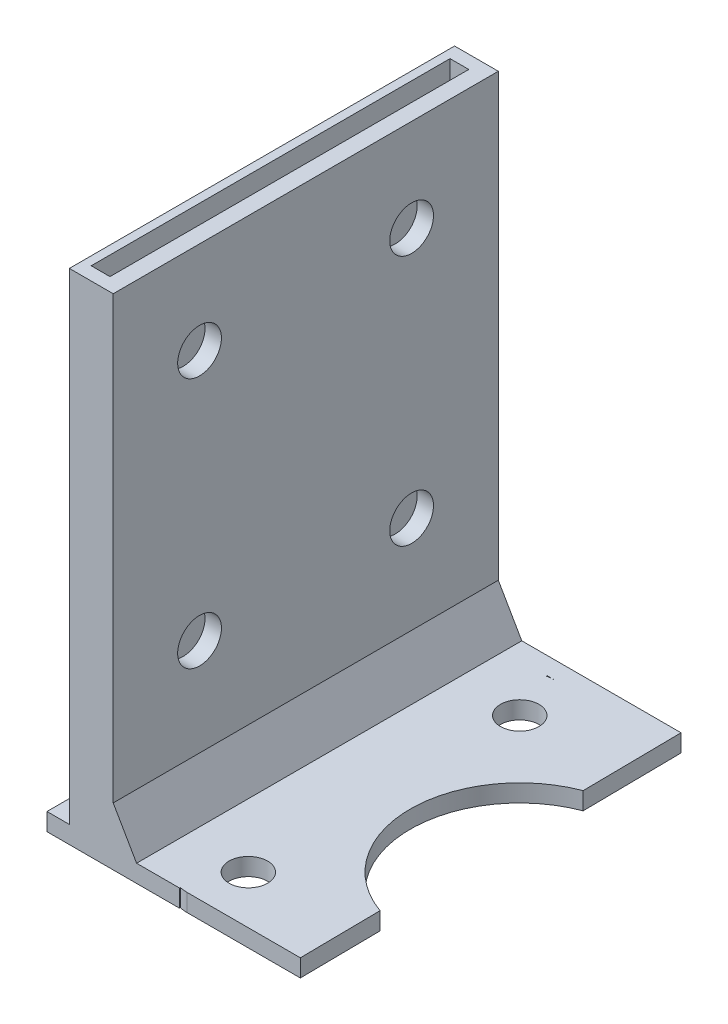
ISO-10303-21;
HEADER;
FILE_DESCRIPTION(('STEP AP214'),'2;1');
FILE_NAME('part.step','',(''),(''),'','','');
FILE_SCHEMA(('AUTOMOTIVE_DESIGN { 1 0 10303 214 1 1 1 1 }'));
ENDSEC;
DATA;
#1=APPLICATION_CONTEXT('core data for automotive mechanical design processes');
#2=APPLICATION_PROTOCOL_DEFINITION('international standard','automotive_design',2000,#1);
#3=PRODUCT_CONTEXT('',#1,'mechanical');
#4=PRODUCT('Part','Part','',(#3));
#5=PRODUCT_RELATED_PRODUCT_CATEGORY('part','',(#4));
#6=PRODUCT_DEFINITION_FORMATION('','',#4);
#7=PRODUCT_DEFINITION_CONTEXT('part definition',#1,'design');
#8=PRODUCT_DEFINITION('design','',#6,#7);
#9=PRODUCT_DEFINITION_SHAPE('','',#8);
#10=(LENGTH_UNIT() NAMED_UNIT(*) SI_UNIT(.MILLI.,.METRE.));
#11=(NAMED_UNIT(*) PLANE_ANGLE_UNIT() SI_UNIT($,.RADIAN.));
#12=(NAMED_UNIT(*) SI_UNIT($,.STERADIAN.) SOLID_ANGLE_UNIT());
#13=UNCERTAINTY_MEASURE_WITH_UNIT(LENGTH_MEASURE(1.E-05),#10,'distance_accuracy_value','');
#14=(GEOMETRIC_REPRESENTATION_CONTEXT(3) GLOBAL_UNCERTAINTY_ASSIGNED_CONTEXT((#13)) GLOBAL_UNIT_ASSIGNED_CONTEXT((#10,
#11,#12)) REPRESENTATION_CONTEXT('',''));
#15=CARTESIAN_POINT('',(0.,0.,0.));
#16=DIRECTION('',(0.,0.,1.));
#17=DIRECTION('',(1.,0.,0.));
#18=AXIS2_PLACEMENT_3D('',#15,#16,#17);
#19=CARTESIAN_POINT('',(3.,2.,0.));
#20=DIRECTION('',(0.,1.,0.));
#21=DIRECTION('',(0.,0.,1.));
#22=AXIS2_PLACEMENT_3D('',#19,#20,#21);
#23=PLANE('',#22);
#24=DIRECTION('',(0.,0.,-1.));
#25=VECTOR('',#24,1.);
#26=CARTESIAN_POINT('',(-22.7644014692472,2.,0.));
#27=LINE('',#26,#25);
#28=CARTESIAN_POINT('',(-22.7644014692472,2.,21.));
#29=VERTEX_POINT('',#28);
#30=CARTESIAN_POINT('',(-22.7644014692472,2.,-23.));
#31=VERTEX_POINT('',#30);
#32=EDGE_CURVE('E65',#29,#31,#27,.T.);
#33=ORIENTED_EDGE('',*,*,#32,.F.);
#34=DIRECTION('',(1.,0.,0.));
#35=VECTOR('',#34,1.);
#36=CARTESIAN_POINT('',(-23.,2.,21.));
#37=LINE('',#36,#35);
#38=CARTESIAN_POINT('',(-17.8654591215677,2.,21.));
#39=VERTEX_POINT('',#38);
#40=EDGE_CURVE('E321',#29,#39,#37,.T.);
#41=ORIENTED_EDGE('',*,*,#40,.T.);
#42=DIRECTION('',(0.,0.,-1.));
#43=VECTOR('',#42,1.);
#44=CARTESIAN_POINT('',(-17.8654591215677,2.,-21.));
#45=LINE('',#44,#43);
#46=CARTESIAN_POINT('',(-17.8654591215677,2.,20.9052503772351));
#47=VERTEX_POINT('',#46);
#48=EDGE_CURVE('E337',#39,#47,#45,.T.);
#49=ORIENTED_EDGE('',*,*,#48,.T.);
#50=CARTESIAN_POINT('',(-17.,2.,17.));
#51=DIRECTION('',(0.,1.,0.));
#52=DIRECTION('',(0.,0.,1.));
#53=AXIS2_PLACEMENT_3D('',#50,#51,#52);
#54=CIRCLE('',#53,4.);
#55=CARTESIAN_POINT('',(-17.,2.,21.));
#56=VERTEX_POINT('',#55);
#57=EDGE_CURVE('E334',#47,#56,#54,.T.);
#58=ORIENTED_EDGE('',*,*,#57,.T.);
#59=DIRECTION('',(1.,0.,0.));
#60=VECTOR('',#59,1.);
#61=CARTESIAN_POINT('',(-21.,2.,21.));
#62=LINE('',#61,#60);
#63=CARTESIAN_POINT('',(-4.0568713567306,2.,21.));
#64=VERTEX_POINT('',#63);
#65=EDGE_CURVE('E318',#56,#64,#62,.T.);
#66=ORIENTED_EDGE('',*,*,#65,.T.);
#67=DIRECTION('',(0.0117787362988032,0.,0.999930628279384));
#68=VECTOR('',#67,1.);
#69=CARTESIAN_POINT('',(-4.57517170926519,2.,-23.));
#70=LINE('',#69,#68);
#71=CARTESIAN_POINT('',(-4.16541339197231,2.,11.7855560443272));
#72=VERTEX_POINT('',#71);
#73=EDGE_CURVE('E271',#72,#64,#70,.T.);
#74=ORIENTED_EDGE('',*,*,#73,.F.);
#75=CARTESIAN_POINT('',(0.,2.,0.));
#76=DIRECTION('',(0.,1.,0.));
#77=DIRECTION('',(0.,0.,1.));
#78=AXIS2_PLACEMENT_3D('',#75,#76,#77);
#79=CIRCLE('',#78,12.5);
#80=CARTESIAN_POINT('',(-4.44187623782958,2.,-11.6841660159296));
#81=VERTEX_POINT('',#80);
#82=EDGE_CURVE('E302',#81,#72,#79,.T.);
#83=ORIENTED_EDGE('',*,*,#82,.F.);
#84=CARTESIAN_POINT('',(-4.57517170926519,2.,-23.));
#85=VERTEX_POINT('',#84);
#86=EDGE_CURVE('E272',#85,#81,#70,.T.);
#87=ORIENTED_EDGE('',*,*,#86,.F.);
#88=DIRECTION('',(1.,0.,0.));
#89=VECTOR('',#88,1.);
#90=CARTESIAN_POINT('',(-23.,2.,-23.));
#91=LINE('',#90,#89);
#92=EDGE_CURVE('E61',#31,#85,#91,.T.);
#93=ORIENTED_EDGE('',*,*,#92,.F.);
#94=EDGE_LOOP('',(#33,#41,#49,#58,#66,#74,#83,#87,#93));
#95=FACE_BOUND('',#94,.T.);
#96=CARTESIAN_POINT('',(-17.8654591215677,2.,-20.9052503772351));
#97=VERTEX_POINT('',#96);
#98=CARTESIAN_POINT('',(-17.8654591215677,2.,-21.));
#99=VERTEX_POINT('',#98);
#100=EDGE_CURVE('E328',#97,#99,#45,.T.);
#101=ORIENTED_EDGE('',*,*,#100,.T.);
#102=DIRECTION('',(1.,0.,0.));
#103=VECTOR('',#102,1.);
#104=CARTESIAN_POINT('',(-23.,2.,-21.));
#105=LINE('',#104,#103);
#106=CARTESIAN_POINT('',(-17.,2.,-21.));
#107=VERTEX_POINT('',#106);
#108=EDGE_CURVE('E333',#99,#107,#105,.T.);
#109=ORIENTED_EDGE('',*,*,#108,.T.);
#110=CARTESIAN_POINT('',(-17.,2.,-17.));
#111=DIRECTION('',(0.,1.,0.));
#112=DIRECTION('',(0.,0.,1.));
#113=AXIS2_PLACEMENT_3D('',#110,#111,#112);
#114=CIRCLE('',#113,4.);
#115=EDGE_CURVE('E322',#107,#97,#114,.T.);
#116=ORIENTED_EDGE('',*,*,#115,.T.);
#117=EDGE_LOOP('',(#101,#109,#116));
#118=FACE_BOUND('',#117,.T.);
#119=CARTESIAN_POINT('',(-15.5,2.,15.5));
#120=DIRECTION('',(0.,1.,0.));
#121=DIRECTION('',(0.,0.,1.));
#122=AXIS2_PLACEMENT_3D('',#119,#120,#121);
#123=CIRCLE('',#122,2.2);
#124=CARTESIAN_POINT('',(-15.5,2.,17.7));
#125=VERTEX_POINT('',#124);
#126=EDGE_CURVE('E299',#125,#125,#123,.T.);
#127=ORIENTED_EDGE('',*,*,#126,.F.);
#128=EDGE_LOOP('',(#127));
#129=FACE_BOUND('',#128,.T.);
#130=CARTESIAN_POINT('',(-15.5,2.,-15.5));
#131=DIRECTION('',(0.,1.,0.));
#132=DIRECTION('',(0.,0.,1.));
#133=AXIS2_PLACEMENT_3D('',#130,#131,#132);
#134=CIRCLE('',#133,2.2);
#135=CARTESIAN_POINT('',(-15.5,2.,-13.3));
#136=VERTEX_POINT('',#135);
#137=EDGE_CURVE('E303',#136,#136,#134,.T.);
#138=ORIENTED_EDGE('',*,*,#137,.F.);
#139=EDGE_LOOP('',(#138));
#140=FACE_BOUND('',#139,.T.);
#141=ADVANCED_FACE('F46',(#95,#118,#129,#140),#23,.T.);
#142=CARTESIAN_POINT('',(0.,0.,-23.));
#143=DIRECTION('',(0.,0.,1.));
#144=DIRECTION('',(1.,0.,0.));
#145=AXIS2_PLACEMENT_3D('',#142,#143,#144);
#146=PLANE('',#145);
#147=DIRECTION('',(-0.499213266251392,0.866479148507693,0.));
#148=VECTOR('',#147,1.);
#149=CARTESIAN_POINT('',(-26.0006860223192,7.61718462518246,-23.));
#150=LINE('',#149,#148);
#151=CARTESIAN_POINT('',(-25.4460640427272,6.65453316315468,-23.));
#152=VERTEX_POINT('',#151);
#153=EDGE_CURVE('E406',#31,#152,#150,.T.);
#154=ORIENTED_EDGE('',*,*,#153,.F.);
#155=ORIENTED_EDGE('',*,*,#92,.T.);
#156=DIRECTION('',(0.,1.,0.));
#157=VECTOR('',#156,1.);
#158=CARTESIAN_POINT('',(-4.57517170926519,-40.0280153353467,-23.));
#159=LINE('',#158,#157);
#160=CARTESIAN_POINT('',(-4.57517170926519,0.,-23.));
#161=VERTEX_POINT('',#160);
#162=EDGE_CURVE('E274',#161,#85,#159,.T.);
#163=ORIENTED_EDGE('',*,*,#162,.F.);
#164=DIRECTION('',(-1.,0.,0.));
#165=VECTOR('',#164,1.);
#166=CARTESIAN_POINT('',(0.,0.,-23.));
#167=LINE('',#166,#165);
#168=CARTESIAN_POINT('',(-33.,0.,-23.));
#169=VERTEX_POINT('',#168);
#170=EDGE_CURVE('E269',#161,#169,#167,.T.);
#171=ORIENTED_EDGE('',*,*,#170,.T.);
#172=DIRECTION('',(0.,-1.,0.));
#173=VECTOR('',#172,1.);
#174=CARTESIAN_POINT('',(-33.,2.,-23.));
#175=LINE('',#174,#173);
#176=CARTESIAN_POINT('',(-33.,2.,-23.));
#177=VERTEX_POINT('',#176);
#178=EDGE_CURVE('E258',#177,#169,#175,.T.);
#179=ORIENTED_EDGE('',*,*,#178,.F.);
#180=CARTESIAN_POINT('',(-30.4410381082632,2.,-23.));
#181=VERTEX_POINT('',#180);
#182=EDGE_CURVE('E54',#177,#181,#91,.T.);
#183=ORIENTED_EDGE('',*,*,#182,.T.);
#184=DIRECTION('',(0.,-1.,0.));
#185=VECTOR('',#184,1.);
#186=CARTESIAN_POINT('',(-30.4410381082632,57.,-23.));
#187=LINE('',#186,#185);
#188=CARTESIAN_POINT('',(-30.4410381082632,57.,-23.));
#189=VERTEX_POINT('',#188);
#190=EDGE_CURVE('E249',#189,#181,#187,.T.);
#191=ORIENTED_EDGE('',*,*,#190,.F.);
#192=DIRECTION('',(-1.,0.,0.));
#193=VECTOR('',#192,1.);
#194=CARTESIAN_POINT('',(0.,57.,-23.));
#195=LINE('',#194,#193);
#196=CARTESIAN_POINT('',(-25.4460640427272,57.,-23.));
#197=VERTEX_POINT('',#196);
#198=EDGE_CURVE('E236',#197,#189,#195,.T.);
#199=ORIENTED_EDGE('',*,*,#198,.F.);
#200=DIRECTION('',(0.,-1.,0.));
#201=VECTOR('',#200,1.);
#202=CARTESIAN_POINT('',(-25.4460640427272,57.,-23.));
#203=LINE('',#202,#201);
#204=EDGE_CURVE('E252',#197,#152,#203,.T.);
#205=ORIENTED_EDGE('',*,*,#204,.T.);
#206=EDGE_LOOP('',(#154,#155,#163,#171,#179,#183,#191,#199,#205));
#207=FACE_BOUND('',#206,.T.);
#208=ADVANCED_FACE('F416',(#207),#146,.F.);
#209=CARTESIAN_POINT('',(0.,0.,21.));
#210=DIRECTION('',(0.,0.,1.));
#211=DIRECTION('',(1.,0.,0.));
#212=AXIS2_PLACEMENT_3D('',#209,#210,#211);
#213=PLANE('',#212);
#214=ORIENTED_EDGE('',*,*,#40,.F.);
#215=DIRECTION('',(-0.499213266251392,0.866479148507693,0.));
#216=VECTOR('',#215,1.);
#217=CARTESIAN_POINT('',(-26.0006860223192,7.61718462518246,21.));
#218=LINE('',#217,#216);
#219=CARTESIAN_POINT('',(-25.4327295607839,6.63138864488741,21.));
#220=VERTEX_POINT('',#219);
#221=EDGE_CURVE('E407',#29,#220,#218,.T.);
#222=ORIENTED_EDGE('',*,*,#221,.T.);
#223=DIRECTION('',(0.,-1.,0.));
#224=VECTOR('',#223,1.);
#225=CARTESIAN_POINT('',(-25.4327295607839,57.,21.));
#226=LINE('',#225,#224);
#227=CARTESIAN_POINT('',(-25.4327295607839,57.,21.));
#228=VERTEX_POINT('',#227);
#229=EDGE_CURVE('E242',#228,#220,#226,.T.);
#230=ORIENTED_EDGE('',*,*,#229,.F.);
#231=DIRECTION('',(1.,0.,0.));
#232=VECTOR('',#231,1.);
#233=CARTESIAN_POINT('',(0.,57.,21.));
#234=LINE('',#233,#232);
#235=CARTESIAN_POINT('',(-30.4410381082632,57.,21.));
#236=VERTEX_POINT('',#235);
#237=EDGE_CURVE('E240',#236,#228,#234,.T.);
#238=ORIENTED_EDGE('',*,*,#237,.F.);
#239=DIRECTION('',(0.,-1.,0.));
#240=VECTOR('',#239,1.);
#241=CARTESIAN_POINT('',(-30.4410381082632,57.,21.));
#242=LINE('',#241,#240);
#243=CARTESIAN_POINT('',(-30.4410381082632,2.,21.));
#244=VERTEX_POINT('',#243);
#245=EDGE_CURVE('E246',#236,#244,#242,.T.);
#246=ORIENTED_EDGE('',*,*,#245,.T.);
#247=CARTESIAN_POINT('',(-33.,2.,21.));
#248=VERTEX_POINT('',#247);
#249=EDGE_CURVE('E350',#248,#244,#37,.T.);
#250=ORIENTED_EDGE('',*,*,#249,.F.);
#251=DIRECTION('',(0.,1.,0.));
#252=VECTOR('',#251,1.);
#253=CARTESIAN_POINT('',(-33.,0.,21.));
#254=LINE('',#253,#252);
#255=CARTESIAN_POINT('',(-33.,0.,21.));
#256=VERTEX_POINT('',#255);
#257=EDGE_CURVE('E264',#256,#248,#254,.T.);
#258=ORIENTED_EDGE('',*,*,#257,.F.);
#259=DIRECTION('',(1.,0.,0.));
#260=VECTOR('',#259,1.);
#261=CARTESIAN_POINT('',(-23.,0.,21.));
#262=LINE('',#261,#260);
#263=CARTESIAN_POINT('',(-17.8654591215677,0.,21.));
#264=VERTEX_POINT('',#263);
#265=EDGE_CURVE('E340',#256,#264,#262,.T.);
#266=ORIENTED_EDGE('',*,*,#265,.T.);
#267=DIRECTION('',(0.,1.,0.));
#268=VECTOR('',#267,1.);
#269=CARTESIAN_POINT('',(-17.8654591215677,0.,21.));
#270=LINE('',#269,#268);
#271=EDGE_CURVE('E293',#264,#39,#270,.T.);
#272=ORIENTED_EDGE('',*,*,#271,.T.);
#273=EDGE_LOOP('',(#214,#222,#230,#238,#246,#250,#258,#266,#272));
#274=FACE_BOUND('',#273,.T.);
#275=ADVANCED_FACE('F48',(#274),#213,.T.);
#276=CARTESIAN_POINT('',(3.,0.,0.));
#277=DIRECTION('',(0.,1.,0.));
#278=DIRECTION('',(0.,0.,1.));
#279=AXIS2_PLACEMENT_3D('',#276,#277,#278);
#280=PLANE('',#279);
#281=ORIENTED_EDGE('',*,*,#265,.F.);
#282=DIRECTION('',(0.,0.,1.));
#283=VECTOR('',#282,1.);
#284=CARTESIAN_POINT('',(-33.,0.,-23.));
#285=LINE('',#284,#283);
#286=EDGE_CURVE('E261',#169,#256,#285,.T.);
#287=ORIENTED_EDGE('',*,*,#286,.F.);
#288=ORIENTED_EDGE('',*,*,#170,.F.);
#289=DIRECTION('',(0.0117787362988032,0.,0.999930628279384));
#290=VECTOR('',#289,1.);
#291=CARTESIAN_POINT('',(-4.30322859901456,0.,0.0860287717615899));
#292=LINE('',#291,#290);
#293=CARTESIAN_POINT('',(-4.44187623782959,0.,-11.6841660159296));
#294=VERTEX_POINT('',#293);
#295=EDGE_CURVE('E278',#161,#294,#292,.T.);
#296=ORIENTED_EDGE('',*,*,#295,.T.);
#297=CARTESIAN_POINT('',(0.,0.,0.));
#298=DIRECTION('',(0.,1.,0.));
#299=DIRECTION('',(0.,0.,1.));
#300=AXIS2_PLACEMENT_3D('',#297,#298,#299);
#301=CIRCLE('',#300,12.5);
#302=CARTESIAN_POINT('',(-4.16541339197231,0.,11.7855560443272));
#303=VERTEX_POINT('',#302);
#304=EDGE_CURVE('E308',#294,#303,#301,.T.);
#305=ORIENTED_EDGE('',*,*,#304,.T.);
#306=CARTESIAN_POINT('',(-4.0568713567306,0.,21.));
#307=VERTEX_POINT('',#306);
#308=EDGE_CURVE('E284',#303,#307,#292,.T.);
#309=ORIENTED_EDGE('',*,*,#308,.T.);
#310=DIRECTION('',(1.,0.,0.));
#311=VECTOR('',#310,1.);
#312=CARTESIAN_POINT('',(-21.,0.,21.));
#313=LINE('',#312,#311);
#314=CARTESIAN_POINT('',(-17.,0.,21.));
#315=VERTEX_POINT('',#314);
#316=EDGE_CURVE('E294',#315,#307,#313,.T.);
#317=ORIENTED_EDGE('',*,*,#316,.F.);
#318=CARTESIAN_POINT('',(-17.,0.,17.));
#319=DIRECTION('',(0.,1.,0.));
#320=DIRECTION('',(0.,0.,1.));
#321=AXIS2_PLACEMENT_3D('',#318,#319,#320);
#322=CIRCLE('',#321,4.);
#323=CARTESIAN_POINT('',(-17.8654591215677,0.,20.9052503772351));
#324=VERTEX_POINT('',#323);
#325=EDGE_CURVE('E313',#315,#324,#322,.F.);
#326=ORIENTED_EDGE('',*,*,#325,.T.);
#327=DIRECTION('',(0.,0.,-1.));
#328=VECTOR('',#327,1.);
#329=CARTESIAN_POINT('',(-17.8654591215677,0.,-21.));
#330=LINE('',#329,#328);
#331=EDGE_CURVE('E342',#264,#324,#330,.T.);
#332=ORIENTED_EDGE('',*,*,#331,.F.);
#333=EDGE_LOOP('',(#281,#287,#288,#296,#305,#309,#317,#326,#332));
#334=FACE_BOUND('',#333,.T.);
#335=CARTESIAN_POINT('',(-17.,0.,-17.));
#336=DIRECTION('',(0.,1.,0.));
#337=DIRECTION('',(0.,0.,1.));
#338=AXIS2_PLACEMENT_3D('',#335,#336,#337);
#339=CIRCLE('',#338,4.);
#340=CARTESIAN_POINT('',(-17.8654591215677,0.,-20.9052503772351));
#341=VERTEX_POINT('',#340);
#342=CARTESIAN_POINT('',(-17.,0.,-21.));
#343=VERTEX_POINT('',#342);
#344=EDGE_CURVE('E325',#341,#343,#339,.F.);
#345=ORIENTED_EDGE('',*,*,#344,.T.);
#346=DIRECTION('',(-1.,0.,0.));
#347=VECTOR('',#346,1.);
#348=CARTESIAN_POINT('',(0.,0.,-21.));
#349=LINE('',#348,#347);
#350=CARTESIAN_POINT('',(-17.8654591215677,0.,-21.));
#351=VERTEX_POINT('',#350);
#352=EDGE_CURVE('E267',#343,#351,#349,.T.);
#353=ORIENTED_EDGE('',*,*,#352,.T.);
#354=EDGE_CURVE('E292',#341,#351,#330,.T.);
#355=ORIENTED_EDGE('',*,*,#354,.F.);
#356=EDGE_LOOP('',(#345,#353,#355));
#357=FACE_BOUND('',#356,.T.);
#358=CARTESIAN_POINT('',(-15.5,0.,15.5));
#359=DIRECTION('',(0.,1.,0.));
#360=DIRECTION('',(0.,0.,1.));
#361=AXIS2_PLACEMENT_3D('',#358,#359,#360);
#362=CIRCLE('',#361,2.2);
#363=CARTESIAN_POINT('',(-15.5,0.,17.7));
#364=VERTEX_POINT('',#363);
#365=EDGE_CURVE('E304',#364,#364,#362,.T.);
#366=ORIENTED_EDGE('',*,*,#365,.T.);
#367=EDGE_LOOP('',(#366));
#368=FACE_BOUND('',#367,.T.);
#369=CARTESIAN_POINT('',(-15.5,0.,-15.5));
#370=DIRECTION('',(0.,1.,0.));
#371=DIRECTION('',(0.,0.,1.));
#372=AXIS2_PLACEMENT_3D('',#369,#370,#371);
#373=CIRCLE('',#372,2.2);
#374=CARTESIAN_POINT('',(-15.5,0.,-13.3));
#375=VERTEX_POINT('',#374);
#376=EDGE_CURVE('E307',#375,#375,#373,.T.);
#377=ORIENTED_EDGE('',*,*,#376,.T.);
#378=EDGE_LOOP('',(#377));
#379=FACE_BOUND('',#378,.T.);
#380=ADVANCED_FACE('F450',(#334,#357,#368,#379),#280,.F.);
#381=DIRECTION('',(0.,0.,1.));
#382=VECTOR('',#381,1.);
#383=CARTESIAN_POINT('',(-30.4410381082632,2.,0.));
#384=LINE('',#383,#382);
#385=EDGE_CURVE('E229',#181,#244,#384,.T.);
#386=ORIENTED_EDGE('',*,*,#385,.F.);
#387=ORIENTED_EDGE('',*,*,#182,.F.);
#388=DIRECTION('',(0.,0.,-1.));
#389=VECTOR('',#388,1.);
#390=CARTESIAN_POINT('',(-33.,2.,21.));
#391=LINE('',#390,#389);
#392=EDGE_CURVE('E255',#248,#177,#391,.T.);
#393=ORIENTED_EDGE('',*,*,#392,.F.);
#394=ORIENTED_EDGE('',*,*,#249,.T.);
#395=EDGE_LOOP('',(#386,#387,#393,#394));
#396=FACE_BOUND('',#395,.T.);
#397=ADVANCED_FACE('F460',(#396),#23,.T.);
#398=CARTESIAN_POINT('',(0.,0.,-21.));
#399=DIRECTION('',(0.,0.,1.));
#400=DIRECTION('',(1.,0.,0.));
#401=AXIS2_PLACEMENT_3D('',#398,#399,#400);
#402=PLANE('',#401);
#403=ORIENTED_EDGE('',*,*,#352,.F.);
#404=DIRECTION('',(0.,-1.,0.));
#405=VECTOR('',#404,1.);
#406=CARTESIAN_POINT('',(-17.,2.,-21.));
#407=LINE('',#406,#405);
#408=EDGE_CURVE('E336',#343,#107,#407,.F.);
#409=ORIENTED_EDGE('',*,*,#408,.T.);
#410=ORIENTED_EDGE('',*,*,#108,.F.);
#411=DIRECTION('',(0.,1.,0.));
#412=VECTOR('',#411,1.);
#413=CARTESIAN_POINT('',(-17.8654591215677,0.,-21.));
#414=LINE('',#413,#412);
#415=EDGE_CURVE('E345',#351,#99,#414,.T.);
#416=ORIENTED_EDGE('',*,*,#415,.F.);
#417=EDGE_LOOP('',(#403,#409,#410,#416));
#418=FACE_BOUND('',#417,.T.);
#419=ADVANCED_FACE('F489',(#418),#402,.T.);
#420=CARTESIAN_POINT('',(-17.,2.,-17.));
#421=DIRECTION('',(0.,-1.,0.));
#422=DIRECTION('',(0.,0.,-1.));
#423=AXIS2_PLACEMENT_3D('',#420,#421,#422);
#424=CYLINDRICAL_SURFACE('',#423,4.);
#425=DIRECTION('',(0.,-1.,0.));
#426=VECTOR('',#425,1.);
#427=CARTESIAN_POINT('',(-17.8654591215677,2.,-20.9052503772351));
#428=LINE('',#427,#426);
#429=EDGE_CURVE('E290',#97,#341,#428,.T.);
#430=ORIENTED_EDGE('',*,*,#429,.F.);
#431=ORIENTED_EDGE('',*,*,#115,.F.);
#432=ORIENTED_EDGE('',*,*,#408,.F.);
#433=ORIENTED_EDGE('',*,*,#344,.F.);
#434=EDGE_LOOP('',(#430,#431,#432,#433));
#435=FACE_BOUND('',#434,.T.);
#436=ADVANCED_FACE('F495',(#435),#424,.T.);
#437=CARTESIAN_POINT('',(-17.8654591215677,0.,-21.));
#438=DIRECTION('',(1.,0.,0.));
#439=DIRECTION('',(0.,0.,-1.));
#440=AXIS2_PLACEMENT_3D('',#437,#438,#439);
#441=PLANE('',#440);
#442=ORIENTED_EDGE('',*,*,#100,.F.);
#443=ORIENTED_EDGE('',*,*,#429,.T.);
#444=ORIENTED_EDGE('',*,*,#354,.T.);
#445=ORIENTED_EDGE('',*,*,#415,.T.);
#446=EDGE_LOOP('',(#442,#443,#444,#445));
#447=FACE_BOUND('',#446,.T.);
#448=ADVANCED_FACE('F501',(#447),#441,.T.);
#449=ORIENTED_EDGE('',*,*,#331,.T.);
#450=DIRECTION('',(0.,-1.,0.));
#451=VECTOR('',#450,1.);
#452=CARTESIAN_POINT('',(-17.8654591215677,2.,20.9052503772351));
#453=LINE('',#452,#451);
#454=EDGE_CURVE('E298',#324,#47,#453,.F.);
#455=ORIENTED_EDGE('',*,*,#454,.T.);
#456=ORIENTED_EDGE('',*,*,#48,.F.);
#457=ORIENTED_EDGE('',*,*,#271,.F.);
#458=EDGE_LOOP('',(#449,#455,#456,#457));
#459=FACE_BOUND('',#458,.T.);
#460=ADVANCED_FACE('F504',(#459),#441,.T.);
#461=CARTESIAN_POINT('',(-17.,2.,17.));
#462=DIRECTION('',(0.,-1.,0.));
#463=DIRECTION('',(0.,0.,-1.));
#464=AXIS2_PLACEMENT_3D('',#461,#462,#463);
#465=CYLINDRICAL_SURFACE('',#464,4.);
#466=ORIENTED_EDGE('',*,*,#454,.F.);
#467=ORIENTED_EDGE('',*,*,#325,.F.);
#468=DIRECTION('',(0.,-1.,0.));
#469=VECTOR('',#468,1.);
#470=CARTESIAN_POINT('',(-17.,2.,21.));
#471=LINE('',#470,#469);
#472=EDGE_CURVE('E297',#56,#315,#471,.T.);
#473=ORIENTED_EDGE('',*,*,#472,.F.);
#474=ORIENTED_EDGE('',*,*,#57,.F.);
#475=EDGE_LOOP('',(#466,#467,#473,#474));
#476=FACE_BOUND('',#475,.T.);
#477=ADVANCED_FACE('F436',(#476),#465,.T.);
#478=CARTESIAN_POINT('',(-21.,2.,21.));
#479=DIRECTION('',(0.,0.,-1.));
#480=DIRECTION('',(-1.,0.,0.));
#481=AXIS2_PLACEMENT_3D('',#478,#479,#480);
#482=PLANE('',#481);
#483=ORIENTED_EDGE('',*,*,#316,.T.);
#484=DIRECTION('',(0.,1.,0.));
#485=VECTOR('',#484,1.);
#486=CARTESIAN_POINT('',(-4.0568713567306,-40.0280153353467,21.));
#487=LINE('',#486,#485);
#488=EDGE_CURVE('E275',#307,#64,#487,.T.);
#489=ORIENTED_EDGE('',*,*,#488,.T.);
#490=ORIENTED_EDGE('',*,*,#65,.F.);
#491=ORIENTED_EDGE('',*,*,#472,.T.);
#492=EDGE_LOOP('',(#483,#489,#490,#491));
#493=FACE_BOUND('',#492,.T.);
#494=ADVANCED_FACE('F439',(#493),#482,.F.);
#495=CARTESIAN_POINT('',(-15.5,0.,-15.5));
#496=DIRECTION('',(0.,1.,0.));
#497=DIRECTION('',(0.,0.,1.));
#498=AXIS2_PLACEMENT_3D('',#495,#496,#497);
#499=CYLINDRICAL_SURFACE('',#498,2.2);
#500=ORIENTED_EDGE('',*,*,#376,.F.);
#501=EDGE_LOOP('',(#500));
#502=FACE_BOUND('',#501,.T.);
#503=ORIENTED_EDGE('',*,*,#137,.T.);
#504=EDGE_LOOP('',(#503));
#505=FACE_BOUND('',#504,.T.);
#506=ADVANCED_FACE('F514',(#502,#505),#499,.F.);
#507=CARTESIAN_POINT('',(-15.5,0.,15.5));
#508=DIRECTION('',(0.,1.,0.));
#509=DIRECTION('',(0.,0.,1.));
#510=AXIS2_PLACEMENT_3D('',#507,#508,#509);
#511=CYLINDRICAL_SURFACE('',#510,2.2);
#512=ORIENTED_EDGE('',*,*,#365,.F.);
#513=EDGE_LOOP('',(#512));
#514=FACE_BOUND('',#513,.T.);
#515=ORIENTED_EDGE('',*,*,#126,.T.);
#516=EDGE_LOOP('',(#515));
#517=FACE_BOUND('',#516,.T.);
#518=ADVANCED_FACE('F513',(#514,#517),#511,.F.);
#519=CARTESIAN_POINT('',(0.,0.,0.));
#520=DIRECTION('',(0.,1.,0.));
#521=DIRECTION('',(0.,0.,1.));
#522=AXIS2_PLACEMENT_3D('',#519,#520,#521);
#523=CYLINDRICAL_SURFACE('',#522,12.5);
#524=ORIENTED_EDGE('',*,*,#82,.T.);
#525=DIRECTION('',(0.,1.,0.));
#526=VECTOR('',#525,1.);
#527=CARTESIAN_POINT('',(-4.16541339197231,0.,11.7855560443272));
#528=LINE('',#527,#526);
#529=EDGE_CURVE('E287',#72,#303,#528,.F.);
#530=ORIENTED_EDGE('',*,*,#529,.T.);
#531=ORIENTED_EDGE('',*,*,#304,.F.);
#532=DIRECTION('',(0.,1.,0.));
#533=VECTOR('',#532,1.);
#534=CARTESIAN_POINT('',(-4.44187623782958,0.,-11.6841660159296));
#535=LINE('',#534,#533);
#536=EDGE_CURVE('E283',#294,#81,#535,.T.);
#537=ORIENTED_EDGE('',*,*,#536,.T.);
#538=EDGE_LOOP('',(#524,#530,#531,#537));
#539=FACE_BOUND('',#538,.T.);
#540=ADVANCED_FACE('F444',(#539),#523,.F.);
#541=CARTESIAN_POINT('',(-4.57517170926519,-40.0280153353467,-23.));
#542=DIRECTION('',(-0.999930628279384,0.,0.0117787362988032));
#543=DIRECTION('',(0.0117787362988032,0.,0.999930628279384));
#544=AXIS2_PLACEMENT_3D('',#541,#542,#543);
#545=PLANE('',#544);
#546=ORIENTED_EDGE('',*,*,#295,.F.);
#547=ORIENTED_EDGE('',*,*,#162,.T.);
#548=ORIENTED_EDGE('',*,*,#86,.T.);
#549=ORIENTED_EDGE('',*,*,#536,.F.);
#550=EDGE_LOOP('',(#546,#547,#548,#549));
#551=FACE_BOUND('',#550,.T.);
#552=ADVANCED_FACE('F447',(#551),#545,.F.);
#553=ORIENTED_EDGE('',*,*,#529,.F.);
#554=ORIENTED_EDGE('',*,*,#73,.T.);
#555=ORIENTED_EDGE('',*,*,#488,.F.);
#556=ORIENTED_EDGE('',*,*,#308,.F.);
#557=EDGE_LOOP('',(#553,#554,#555,#556));
#558=FACE_BOUND('',#557,.T.);
#559=ADVANCED_FACE('F523',(#558),#545,.F.);
#560=CARTESIAN_POINT('',(-33.,0.,0.));
#561=DIRECTION('',(-1.,0.,0.));
#562=DIRECTION('',(0.,0.,1.));
#563=AXIS2_PLACEMENT_3D('',#560,#561,#562);
#564=PLANE('',#563);
#565=ORIENTED_EDGE('',*,*,#392,.T.);
#566=ORIENTED_EDGE('',*,*,#178,.T.);
#567=ORIENTED_EDGE('',*,*,#286,.T.);
#568=ORIENTED_EDGE('',*,*,#257,.T.);
#569=EDGE_LOOP('',(#565,#566,#567,#568));
#570=FACE_BOUND('',#569,.T.);
#571=ADVANCED_FACE('F456',(#570),#564,.T.);
#572=CARTESIAN_POINT('',(-25.4390914089405,57.,0.00770947966014402));
#573=DIRECTION('',(0.99999995407841,0.,-0.000303056393885317));
#574=DIRECTION('',(-0.000303056393885317,0.,-0.99999995407841));
#575=AXIS2_PLACEMENT_3D('',#572,#573,#574);
#576=PLANE('',#575);
#577=DIRECTION('',(0.000303056351959237,-0.000526011681875561,0.999999815734262));
#578=VECTOR('',#577,1.);
#579=CARTESIAN_POINT('',(-25.4390994365001,6.6424447703148,-0.0187791851095146));
#580=LINE('',#579,#578);
#581=EDGE_CURVE('E12',#152,#220,#580,.T.);
#582=ORIENTED_EDGE('',*,*,#581,.F.);
#583=ORIENTED_EDGE('',*,*,#204,.F.);
#584=DIRECTION('',(0.000303056393885317,0.,0.99999995407841));
#585=VECTOR('',#584,1.);
#586=CARTESIAN_POINT('',(-25.4390914089405,57.,0.00770947966014402));
#587=LINE('',#586,#585);
#588=EDGE_CURVE('E233',#197,#228,#587,.T.);
#589=ORIENTED_EDGE('',*,*,#588,.T.);
#590=ORIENTED_EDGE('',*,*,#229,.T.);
#591=EDGE_LOOP('',(#582,#583,#589,#590));
#592=FACE_BOUND('',#591,.T.);
#593=CARTESIAN_POINT('',(-25.4430619492911,17.7475018107337,-13.093945025336));
#594=DIRECTION('',(0.99999995407841,0.,-0.00030305639388531));
#595=DIRECTION('',(-0.00030305639388531,0.,-0.99999995407841));
#596=AXIS2_PLACEMENT_3D('',#593,#594,#595);
#597=CIRCLE('',#596,2.5);
#598=CARTESIAN_POINT('',(-25.4438195902758,17.7475018107337,-15.5939449105321));
#599=VERTEX_POINT('',#598);
#600=EDGE_CURVE('E397',#599,#599,#597,.T.);
#601=ORIENTED_EDGE('',*,*,#600,.F.);
#602=EDGE_LOOP('',(#601));
#603=FACE_BOUND('',#602,.T.);
#604=CARTESIAN_POINT('',(-25.4430619492911,46.4376634498858,-13.093945025336));
#605=DIRECTION('',(0.99999995407841,0.,-0.00030305639388531));
#606=DIRECTION('',(-0.00030305639388531,0.,-0.99999995407841));
#607=AXIS2_PLACEMENT_3D('',#604,#605,#606);
#608=CIRCLE('',#607,2.5);
#609=CARTESIAN_POINT('',(-25.4438195902758,46.4376634498858,-15.5939449105321));
#610=VERTEX_POINT('',#609);
#611=EDGE_CURVE('E400',#610,#610,#608,.T.);
#612=ORIENTED_EDGE('',*,*,#611,.F.);
#613=EDGE_LOOP('',(#612));
#614=FACE_BOUND('',#613,.T.);
#615=CARTESIAN_POINT('',(-25.4357187258766,46.4376634498858,11.1366048836259));
#616=DIRECTION('',(0.99999995407841,0.,-0.00030305639388531));
#617=DIRECTION('',(-0.00030305639388531,0.,-0.99999995407841));
#618=AXIS2_PLACEMENT_3D('',#615,#616,#617);
#619=CIRCLE('',#618,2.5);
#620=CARTESIAN_POINT('',(-25.4364763668613,46.4376634498858,8.63660499842983));
#621=VERTEX_POINT('',#620);
#622=EDGE_CURVE('E396',#621,#621,#619,.T.);
#623=ORIENTED_EDGE('',*,*,#622,.F.);
#624=EDGE_LOOP('',(#623));
#625=FACE_BOUND('',#624,.T.);
#626=CARTESIAN_POINT('',(-25.4357187258766,17.7475018107337,11.1366048836259));
#627=DIRECTION('',(0.99999995407841,0.,-0.00030305639388531));
#628=DIRECTION('',(-0.00030305639388531,0.,-0.99999995407841));
#629=AXIS2_PLACEMENT_3D('',#626,#627,#628);
#630=CIRCLE('',#629,2.5);
#631=CARTESIAN_POINT('',(-25.4364763668613,17.7475018107337,8.63660499842984));
#632=VERTEX_POINT('',#631);
#633=EDGE_CURVE('E362',#632,#632,#630,.T.);
#634=ORIENTED_EDGE('',*,*,#633,.F.);
#635=EDGE_LOOP('',(#634));
#636=FACE_BOUND('',#635,.T.);
#637=ADVANCED_FACE('F422',(#592,#603,#614,#625,#636),#576,.T.);
#638=CARTESIAN_POINT('',(-30.4410381082632,57.,0.));
#639=DIRECTION('',(1.,0.,0.));
#640=DIRECTION('',(0.,0.,-1.));
#641=AXIS2_PLACEMENT_3D('',#638,#639,#640);
#642=PLANE('',#641);
#643=CARTESIAN_POINT('',(-30.4410381082632,17.7475018107337,-13.092430356635));
#644=DIRECTION('',(1.,0.,0.));
#645=DIRECTION('',(0.,0.,-1.));
#646=AXIS2_PLACEMENT_3D('',#643,#644,#645);
#647=ELLIPSE('',#646,2.50000011480398,2.5);
#648=CARTESIAN_POINT('',(-30.4410381082632,17.7475018107337,-15.592430471439));
#649=VERTEX_POINT('',#648);
#650=EDGE_CURVE('E217',#649,#649,#647,.T.);
#651=ORIENTED_EDGE('',*,*,#650,.T.);
#652=EDGE_LOOP('',(#651));
#653=FACE_BOUND('',#652,.T.);
#654=CARTESIAN_POINT('',(-30.4410381082632,46.4376634498858,-13.092430356635));
#655=DIRECTION('',(1.,0.,0.));
#656=DIRECTION('',(0.,0.,-1.));
#657=AXIS2_PLACEMENT_3D('',#654,#655,#656);
#658=ELLIPSE('',#657,2.50000011480398,2.5);
#659=CARTESIAN_POINT('',(-30.4410381082632,46.4376634498858,-15.592430471439));
#660=VERTEX_POINT('',#659);
#661=EDGE_CURVE('E375',#660,#660,#658,.T.);
#662=ORIENTED_EDGE('',*,*,#661,.T.);
#663=EDGE_LOOP('',(#662));
#664=FACE_BOUND('',#663,.T.);
#665=CARTESIAN_POINT('',(-30.4410381082632,46.4376634498858,11.1381217777378));
#666=DIRECTION('',(1.,0.,0.));
#667=DIRECTION('',(0.,0.,-1.));
#668=AXIS2_PLACEMENT_3D('',#665,#666,#667);
#669=ELLIPSE('',#668,2.50000011480398,2.5);
#670=CARTESIAN_POINT('',(-30.4410381082632,46.4376634498858,8.63812166293381));
#671=VERTEX_POINT('',#670);
#672=EDGE_CURVE('E371',#671,#671,#669,.T.);
#673=ORIENTED_EDGE('',*,*,#672,.T.);
#674=EDGE_LOOP('',(#673));
#675=FACE_BOUND('',#674,.T.);
#676=CARTESIAN_POINT('',(-30.4410381082632,17.7475018107337,11.1381217777378));
#677=DIRECTION('',(1.,0.,0.));
#678=DIRECTION('',(0.,0.,-1.));
#679=AXIS2_PLACEMENT_3D('',#676,#677,#678);
#680=ELLIPSE('',#679,2.50000011480398,2.5);
#681=CARTESIAN_POINT('',(-30.4410381082632,17.7475018107337,8.63812166293381));
#682=VERTEX_POINT('',#681);
#683=EDGE_CURVE('E367',#682,#682,#680,.T.);
#684=ORIENTED_EDGE('',*,*,#683,.T.);
#685=EDGE_LOOP('',(#684));
#686=FACE_BOUND('',#685,.T.);
#687=ORIENTED_EDGE('',*,*,#385,.T.);
#688=ORIENTED_EDGE('',*,*,#245,.F.);
#689=DIRECTION('',(0.,0.,1.));
#690=VECTOR('',#689,1.);
#691=CARTESIAN_POINT('',(-30.4410381082632,57.,0.));
#692=LINE('',#691,#690);
#693=EDGE_CURVE('E238',#189,#236,#692,.T.);
#694=ORIENTED_EDGE('',*,*,#693,.F.);
#695=ORIENTED_EDGE('',*,*,#190,.T.);
#696=EDGE_LOOP('',(#687,#688,#694,#695));
#697=FACE_BOUND('',#696,.T.);
#698=ADVANCED_FACE('F463',(#653,#664,#675,#686,#697),#642,.F.);
#699=CARTESIAN_POINT('',(0.,57.,0.));
#700=DIRECTION('',(0.,1.,0.));
#701=DIRECTION('',(0.,0.,1.));
#702=AXIS2_PLACEMENT_3D('',#699,#700,#701);
#703=PLANE('',#702);
#704=DIRECTION('',(0.,0.,-1.));
#705=VECTOR('',#704,1.);
#706=CARTESIAN_POINT('',(-27.3101025449577,57.,0.));
#707=LINE('',#706,#705);
#708=CARTESIAN_POINT('',(-27.3101025449577,57.,19.4928532415956));
#709=VERTEX_POINT('',#708);
#710=CARTESIAN_POINT('',(-27.3101025449577,57.,-21.4928532415956));
#711=VERTEX_POINT('',#710);
#712=EDGE_CURVE('E194',#709,#711,#707,.T.);
#713=ORIENTED_EDGE('',*,*,#712,.F.);
#714=DIRECTION('',(1.,0.,0.));
#715=VECTOR('',#714,1.);
#716=CARTESIAN_POINT('',(0.,57.,19.4928532415956));
#717=LINE('',#716,#715);
#718=CARTESIAN_POINT('',(-29.4541772809402,57.,19.4928532415956));
#719=VERTEX_POINT('',#718);
#720=EDGE_CURVE('E211',#719,#709,#717,.T.);
#721=ORIENTED_EDGE('',*,*,#720,.F.);
#722=DIRECTION('',(0.,0.,1.));
#723=VECTOR('',#722,1.);
#724=CARTESIAN_POINT('',(-29.4541772809402,57.,0.));
#725=LINE('',#724,#723);
#726=CARTESIAN_POINT('',(-29.4541772809402,57.,-21.4928532415956));
#727=VERTEX_POINT('',#726);
#728=EDGE_CURVE('E214',#727,#719,#725,.T.);
#729=ORIENTED_EDGE('',*,*,#728,.F.);
#730=DIRECTION('',(-1.,0.,0.));
#731=VECTOR('',#730,1.);
#732=CARTESIAN_POINT('',(0.,57.,-21.4928532415956));
#733=LINE('',#732,#731);
#734=EDGE_CURVE('E223',#711,#727,#733,.T.);
#735=ORIENTED_EDGE('',*,*,#734,.F.);
#736=EDGE_LOOP('',(#713,#721,#729,#735));
#737=FACE_BOUND('',#736,.T.);
#738=ORIENTED_EDGE('',*,*,#588,.F.);
#739=ORIENTED_EDGE('',*,*,#198,.T.);
#740=ORIENTED_EDGE('',*,*,#693,.T.);
#741=ORIENTED_EDGE('',*,*,#237,.T.);
#742=EDGE_LOOP('',(#738,#739,#740,#741));
#743=FACE_BOUND('',#742,.T.);
#744=ADVANCED_FACE('F466',(#737,#743),#703,.T.);
#745=CARTESIAN_POINT('',(-27.3101025449577,10.,0.));
#746=DIRECTION('',(1.,0.,0.));
#747=DIRECTION('',(0.,0.,-1.));
#748=AXIS2_PLACEMENT_3D('',#745,#746,#747);
#749=PLANE('',#748);
#750=CARTESIAN_POINT('',(-27.3101025449577,17.7475018107337,-13.0933792067199));
#751=DIRECTION('',(1.,0.,0.));
#752=DIRECTION('',(0.,0.,-1.));
#753=AXIS2_PLACEMENT_3D('',#750,#751,#752);
#754=ELLIPSE('',#753,2.50000011480398,2.5);
#755=CARTESIAN_POINT('',(-27.3101025449577,17.7475018107337,-15.5933793215239));
#756=VERTEX_POINT('',#755);
#757=EDGE_CURVE('E374',#756,#756,#754,.T.);
#758=ORIENTED_EDGE('',*,*,#757,.T.);
#759=EDGE_LOOP('',(#758));
#760=FACE_BOUND('',#759,.T.);
#761=CARTESIAN_POINT('',(-27.3101025449577,46.4376634498858,-13.0933792067199));
#762=DIRECTION('',(1.,0.,0.));
#763=DIRECTION('',(0.,0.,-1.));
#764=AXIS2_PLACEMENT_3D('',#761,#762,#763);
#765=ELLIPSE('',#764,2.50000011480398,2.5);
#766=CARTESIAN_POINT('',(-27.3101025449577,46.4376634498858,-15.5933793215239));
#767=VERTEX_POINT('',#766);
#768=EDGE_CURVE('E370',#767,#767,#765,.T.);
#769=ORIENTED_EDGE('',*,*,#768,.T.);
#770=EDGE_LOOP('',(#769));
#771=FACE_BOUND('',#770,.T.);
#772=CARTESIAN_POINT('',(-27.3101025449577,46.4376634498858,11.1371729276529));
#773=DIRECTION('',(1.,0.,0.));
#774=DIRECTION('',(0.,0.,-1.));
#775=AXIS2_PLACEMENT_3D('',#772,#773,#774);
#776=ELLIPSE('',#775,2.50000011480398,2.5);
#777=CARTESIAN_POINT('',(-27.3101025449577,46.4376634498858,8.63717281284893));
#778=VERTEX_POINT('',#777);
#779=EDGE_CURVE('E366',#778,#778,#776,.T.);
#780=ORIENTED_EDGE('',*,*,#779,.T.);
#781=EDGE_LOOP('',(#780));
#782=FACE_BOUND('',#781,.T.);
#783=CARTESIAN_POINT('',(-27.3101025449577,17.7475018107337,11.1371729276529));
#784=DIRECTION('',(1.,0.,0.));
#785=DIRECTION('',(0.,0.,-1.));
#786=AXIS2_PLACEMENT_3D('',#783,#784,#785);
#787=ELLIPSE('',#786,2.50000011480398,2.5);
#788=CARTESIAN_POINT('',(-27.3101025449577,17.7475018107337,8.63717281284894));
#789=VERTEX_POINT('',#788);
#790=EDGE_CURVE('E361',#789,#789,#787,.T.);
#791=ORIENTED_EDGE('',*,*,#790,.T.);
#792=EDGE_LOOP('',(#791));
#793=FACE_BOUND('',#792,.T.);
#794=ORIENTED_EDGE('',*,*,#712,.T.);
#795=DIRECTION('',(0.,1.,0.));
#796=VECTOR('',#795,1.);
#797=CARTESIAN_POINT('',(-27.3101025449577,10.,-21.4928532415956));
#798=LINE('',#797,#796);
#799=CARTESIAN_POINT('',(-27.3101025449577,10.,-21.4928532415956));
#800=VERTEX_POINT('',#799);
#801=EDGE_CURVE('E187',#800,#711,#798,.T.);
#802=ORIENTED_EDGE('',*,*,#801,.F.);
#803=DIRECTION('',(0.,0.,-1.));
#804=VECTOR('',#803,1.);
#805=CARTESIAN_POINT('',(-27.3101025449577,10.,0.));
#806=LINE('',#805,#804);
#807=CARTESIAN_POINT('',(-27.3101025449577,10.,19.4928532415956));
#808=VERTEX_POINT('',#807);
#809=EDGE_CURVE('E191',#808,#800,#806,.T.);
#810=ORIENTED_EDGE('',*,*,#809,.F.);
#811=DIRECTION('',(0.,1.,0.));
#812=VECTOR('',#811,1.);
#813=CARTESIAN_POINT('',(-27.3101025449577,10.,19.4928532415956));
#814=LINE('',#813,#812);
#815=EDGE_CURVE('E227',#808,#709,#814,.T.);
#816=ORIENTED_EDGE('',*,*,#815,.T.);
#817=EDGE_LOOP('',(#794,#802,#810,#816));
#818=FACE_BOUND('',#817,.T.);
#819=ADVANCED_FACE('F189',(#760,#771,#782,#793,#818),#749,.F.);
#820=CARTESIAN_POINT('',(0.,10.,19.4928532415956));
#821=DIRECTION('',(0.,0.,1.));
#822=DIRECTION('',(1.,0.,0.));
#823=AXIS2_PLACEMENT_3D('',#820,#821,#822);
#824=PLANE('',#823);
#825=ORIENTED_EDGE('',*,*,#720,.T.);
#826=ORIENTED_EDGE('',*,*,#815,.F.);
#827=DIRECTION('',(1.,0.,0.));
#828=VECTOR('',#827,1.);
#829=CARTESIAN_POINT('',(0.,10.,19.4928532415956));
#830=LINE('',#829,#828);
#831=CARTESIAN_POINT('',(-29.4541772809402,10.,19.4928532415956));
#832=VERTEX_POINT('',#831);
#833=EDGE_CURVE('E199',#832,#808,#830,.T.);
#834=ORIENTED_EDGE('',*,*,#833,.F.);
#835=DIRECTION('',(0.,1.,0.));
#836=VECTOR('',#835,1.);
#837=CARTESIAN_POINT('',(-29.4541772809402,10.,19.4928532415956));
#838=LINE('',#837,#836);
#839=EDGE_CURVE('E230',#832,#719,#838,.T.);
#840=ORIENTED_EDGE('',*,*,#839,.T.);
#841=EDGE_LOOP('',(#825,#826,#834,#840));
#842=FACE_BOUND('',#841,.T.);
#843=ADVANCED_FACE('F474',(#842),#824,.F.);
#844=CARTESIAN_POINT('',(-29.4541772809402,10.,0.));
#845=DIRECTION('',(-1.,0.,0.));
#846=DIRECTION('',(0.,0.,1.));
#847=AXIS2_PLACEMENT_3D('',#844,#845,#846);
#848=PLANE('',#847);
#849=CARTESIAN_POINT('',(-29.4541772809402,17.7475018107337,-13.0927294311323));
#850=DIRECTION('',(-1.,0.,0.));
#851=DIRECTION('',(0.,0.,-1.));
#852=AXIS2_PLACEMENT_3D('',#849,#850,#851);
#853=ELLIPSE('',#852,2.50000011480398,2.5);
#854=CARTESIAN_POINT('',(-29.4541772809402,17.7475018107337,-15.5927295459363));
#855=VERTEX_POINT('',#854);
#856=EDGE_CURVE('E372',#855,#855,#853,.T.);
#857=ORIENTED_EDGE('',*,*,#856,.T.);
#858=EDGE_LOOP('',(#857));
#859=FACE_BOUND('',#858,.T.);
#860=CARTESIAN_POINT('',(-29.4541772809402,46.4376634498858,-13.0927294311323));
#861=DIRECTION('',(-1.,0.,0.));
#862=DIRECTION('',(0.,0.,-1.));
#863=AXIS2_PLACEMENT_3D('',#860,#861,#862);
#864=ELLIPSE('',#863,2.50000011480398,2.5);
#865=CARTESIAN_POINT('',(-29.4541772809402,46.4376634498858,-15.5927295459363));
#866=VERTEX_POINT('',#865);
#867=EDGE_CURVE('E368',#866,#866,#864,.T.);
#868=ORIENTED_EDGE('',*,*,#867,.T.);
#869=EDGE_LOOP('',(#868));
#870=FACE_BOUND('',#869,.T.);
#871=CARTESIAN_POINT('',(-29.4541772809402,46.4376634498858,11.1378227032405));
#872=DIRECTION('',(-1.,0.,0.));
#873=DIRECTION('',(0.,0.,-1.));
#874=AXIS2_PLACEMENT_3D('',#871,#872,#873);
#875=ELLIPSE('',#874,2.50000011480398,2.5);
#876=CARTESIAN_POINT('',(-29.4541772809402,46.4376634498858,8.63782258843648));
#877=VERTEX_POINT('',#876);
#878=EDGE_CURVE('E363',#877,#877,#875,.T.);
#879=ORIENTED_EDGE('',*,*,#878,.T.);
#880=EDGE_LOOP('',(#879));
#881=FACE_BOUND('',#880,.T.);
#882=CARTESIAN_POINT('',(-29.4541772809402,17.7475018107337,11.1378227032405));
#883=DIRECTION('',(-1.,0.,0.));
#884=DIRECTION('',(0.,0.,-1.));
#885=AXIS2_PLACEMENT_3D('',#882,#883,#884);
#886=ELLIPSE('',#885,2.50000011480398,2.5);
#887=CARTESIAN_POINT('',(-29.4541772809402,17.7475018107337,8.63782258843648));
#888=VERTEX_POINT('',#887);
#889=EDGE_CURVE('E358',#888,#888,#886,.T.);
#890=ORIENTED_EDGE('',*,*,#889,.T.);
#891=EDGE_LOOP('',(#890));
#892=FACE_BOUND('',#891,.T.);
#893=ORIENTED_EDGE('',*,*,#728,.T.);
#894=ORIENTED_EDGE('',*,*,#839,.F.);
#895=DIRECTION('',(0.,0.,1.));
#896=VECTOR('',#895,1.);
#897=CARTESIAN_POINT('',(-29.4541772809402,10.,0.));
#898=LINE('',#897,#896);
#899=CARTESIAN_POINT('',(-29.4541772809402,10.,-21.4928532415956));
#900=VERTEX_POINT('',#899);
#901=EDGE_CURVE('E207',#900,#832,#898,.T.);
#902=ORIENTED_EDGE('',*,*,#901,.F.);
#903=DIRECTION('',(0.,1.,0.));
#904=VECTOR('',#903,1.);
#905=CARTESIAN_POINT('',(-29.4541772809402,10.,-21.4928532415956));
#906=LINE('',#905,#904);
#907=EDGE_CURVE('E198',#900,#727,#906,.T.);
#908=ORIENTED_EDGE('',*,*,#907,.T.);
#909=EDGE_LOOP('',(#893,#894,#902,#908));
#910=FACE_BOUND('',#909,.T.);
#911=ADVANCED_FACE('F645',(#859,#870,#881,#892,#910),#848,.F.);
#912=CARTESIAN_POINT('',(0.,10.,-21.4928532415956));
#913=DIRECTION('',(0.,0.,-1.));
#914=DIRECTION('',(-1.,0.,0.));
#915=AXIS2_PLACEMENT_3D('',#912,#913,#914);
#916=PLANE('',#915);
#917=ORIENTED_EDGE('',*,*,#734,.T.);
#918=ORIENTED_EDGE('',*,*,#907,.F.);
#919=DIRECTION('',(-1.,0.,0.));
#920=VECTOR('',#919,1.);
#921=CARTESIAN_POINT('',(0.,10.,-21.4928532415956));
#922=LINE('',#921,#920);
#923=EDGE_CURVE('E202',#800,#900,#922,.T.);
#924=ORIENTED_EDGE('',*,*,#923,.F.);
#925=ORIENTED_EDGE('',*,*,#801,.T.);
#926=EDGE_LOOP('',(#917,#918,#924,#925));
#927=FACE_BOUND('',#926,.T.);
#928=ADVANCED_FACE('F203',(#927),#916,.F.);
#929=CARTESIAN_POINT('',(0.,10.,0.));
#930=DIRECTION('',(0.,1.,0.));
#931=DIRECTION('',(0.,0.,1.));
#932=AXIS2_PLACEMENT_3D('',#929,#930,#931);
#933=PLANE('',#932);
#934=ORIENTED_EDGE('',*,*,#809,.T.);
#935=ORIENTED_EDGE('',*,*,#923,.T.);
#936=ORIENTED_EDGE('',*,*,#901,.T.);
#937=ORIENTED_EDGE('',*,*,#833,.T.);
#938=EDGE_LOOP('',(#934,#935,#936,#937));
#939=FACE_BOUND('',#938,.T.);
#940=ADVANCED_FACE('F209',(#939),#933,.T.);
#941=CARTESIAN_POINT('',(-33.0029884700905,17.7475018107337,11.1388981932114));
#942=DIRECTION('',(0.99999995407841,0.,-0.000303056393885317));
#943=DIRECTION('',(-0.000303056393885317,0.,-0.99999995407841));
#944=AXIS2_PLACEMENT_3D('',#941,#942,#943);
#945=CYLINDRICAL_SURFACE('',#944,2.5);
#946=ORIENTED_EDGE('',*,*,#889,.F.);
#947=EDGE_LOOP('',(#946));
#948=FACE_BOUND('',#947,.T.);
#949=ORIENTED_EDGE('',*,*,#683,.F.);
#950=EDGE_LOOP('',(#949));
#951=FACE_BOUND('',#950,.T.);
#952=ADVANCED_FACE('F595',(#948,#951),#945,.F.);
#953=CARTESIAN_POINT('',(-33.0029884700905,46.4376634498858,11.1388981932114));
#954=DIRECTION('',(0.99999995407841,0.,-0.000303056393885317));
#955=DIRECTION('',(-0.000303056393885317,0.,-0.99999995407841));
#956=AXIS2_PLACEMENT_3D('',#953,#954,#955);
#957=CYLINDRICAL_SURFACE('',#956,2.5);
#958=ORIENTED_EDGE('',*,*,#878,.F.);
#959=EDGE_LOOP('',(#958));
#960=FACE_BOUND('',#959,.T.);
#961=ORIENTED_EDGE('',*,*,#672,.F.);
#962=EDGE_LOOP('',(#961));
#963=FACE_BOUND('',#962,.T.);
#964=ADVANCED_FACE('F585',(#960,#963),#957,.F.);
#965=CARTESIAN_POINT('',(-33.010331693505,46.4376634498858,-13.0916517157505));
#966=DIRECTION('',(0.99999995407841,0.,-0.000303056393885317));
#967=DIRECTION('',(-0.000303056393885317,0.,-0.99999995407841));
#968=AXIS2_PLACEMENT_3D('',#965,#966,#967);
#969=CYLINDRICAL_SURFACE('',#968,2.5);
#970=ORIENTED_EDGE('',*,*,#867,.F.);
#971=EDGE_LOOP('',(#970));
#972=FACE_BOUND('',#971,.T.);
#973=ORIENTED_EDGE('',*,*,#661,.F.);
#974=EDGE_LOOP('',(#973));
#975=FACE_BOUND('',#974,.T.);
#976=ADVANCED_FACE('F574',(#972,#975),#969,.F.);
#977=CARTESIAN_POINT('',(-33.010331693505,17.7475018107337,-13.0916517157505));
#978=DIRECTION('',(0.99999995407841,0.,-0.000303056393885317));
#979=DIRECTION('',(-0.000303056393885317,0.,-0.99999995407841));
#980=AXIS2_PLACEMENT_3D('',#977,#978,#979);
#981=CYLINDRICAL_SURFACE('',#980,2.5);
#982=ORIENTED_EDGE('',*,*,#856,.F.);
#983=EDGE_LOOP('',(#982));
#984=FACE_BOUND('',#983,.T.);
#985=ORIENTED_EDGE('',*,*,#650,.F.);
#986=EDGE_LOOP('',(#985));
#987=FACE_BOUND('',#986,.T.);
#988=ADVANCED_FACE('F563',(#984,#987),#981,.F.);
#989=ORIENTED_EDGE('',*,*,#633,.T.);
#990=EDGE_LOOP('',(#989));
#991=FACE_BOUND('',#990,.T.);
#992=ORIENTED_EDGE('',*,*,#790,.F.);
#993=EDGE_LOOP('',(#992));
#994=FACE_BOUND('',#993,.T.);
#995=ADVANCED_FACE('F582',(#991,#994),#945,.F.);
#996=ORIENTED_EDGE('',*,*,#622,.T.);
#997=EDGE_LOOP('',(#996));
#998=FACE_BOUND('',#997,.T.);
#999=ORIENTED_EDGE('',*,*,#779,.F.);
#1000=EDGE_LOOP('',(#999));
#1001=FACE_BOUND('',#1000,.T.);
#1002=ADVANCED_FACE('F571',(#998,#1001),#957,.F.);
#1003=ORIENTED_EDGE('',*,*,#611,.T.);
#1004=EDGE_LOOP('',(#1003));
#1005=FACE_BOUND('',#1004,.T.);
#1006=ORIENTED_EDGE('',*,*,#768,.F.);
#1007=EDGE_LOOP('',(#1006));
#1008=FACE_BOUND('',#1007,.T.);
#1009=ADVANCED_FACE('F560',(#1005,#1008),#969,.F.);
#1010=ORIENTED_EDGE('',*,*,#600,.T.);
#1011=EDGE_LOOP('',(#1010));
#1012=FACE_BOUND('',#1011,.T.);
#1013=ORIENTED_EDGE('',*,*,#757,.F.);
#1014=EDGE_LOOP('',(#1013));
#1015=FACE_BOUND('',#1014,.T.);
#1016=ADVANCED_FACE('F542',(#1012,#1015),#981,.F.);
#1017=CARTESIAN_POINT('',(-26.0006860223192,7.61718462518246,-23.));
#1018=DIRECTION('',(0.866479148507693,0.499213266251392,0.));
#1019=DIRECTION('',(-0.499213266251392,0.866479148507693,0.));
#1020=AXIS2_PLACEMENT_3D('',#1017,#1018,#1019);
#1021=PLANE('',#1020);
#1022=ORIENTED_EDGE('',*,*,#221,.F.);
#1023=ORIENTED_EDGE('',*,*,#32,.T.);
#1024=ORIENTED_EDGE('',*,*,#153,.T.);
#1025=ORIENTED_EDGE('',*,*,#581,.T.);
#1026=EDGE_LOOP('',(#1022,#1023,#1024,#1025));
#1027=FACE_BOUND('',#1026,.T.);
#1028=ADVANCED_FACE('F414',(#1027),#1021,.T.);
#1029=CLOSED_SHELL('',(#141,#208,#275,#380,#397,#419,#436,#448,#460,#477,#494,#506,#518,#540,
#552,#559,#571,#637,#698,#744,#819,#843,#911,#928,#940,#952,#964,#976,#988,#995,#1002,#1009,
#1016,#1028));
#1030=MANIFOLD_SOLID_BREP('B2',#1029);
#1031=ADVANCED_BREP_SHAPE_REPRESENTATION('',(#18,#1030),#14);
#1032=SHAPE_DEFINITION_REPRESENTATION(#9,#1031);
ENDSEC;
END-ISO-10303-21;
